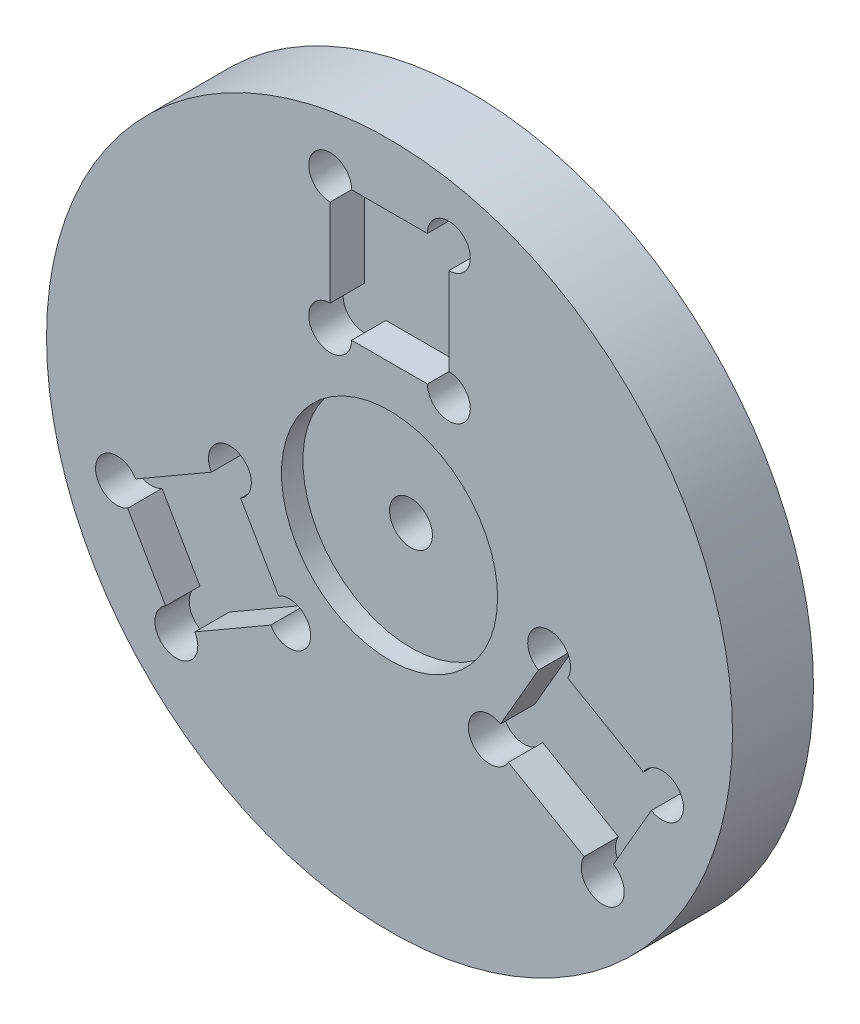
ISO-10303-21;
HEADER;
FILE_DESCRIPTION(('STEP AP214'),'2;1');
FILE_NAME('part.step','',(''),(''),'','','');
FILE_SCHEMA(('AUTOMOTIVE_DESIGN { 1 0 10303 214 1 1 1 1 }'));
ENDSEC;
DATA;
#1=APPLICATION_CONTEXT('core data for automotive mechanical design processes');
#2=APPLICATION_PROTOCOL_DEFINITION('international standard','automotive_design',2000,#1);
#3=PRODUCT_CONTEXT('',#1,'mechanical');
#4=PRODUCT('Part','Part','',(#3));
#5=PRODUCT_RELATED_PRODUCT_CATEGORY('part','',(#4));
#6=PRODUCT_DEFINITION_FORMATION('','',#4);
#7=PRODUCT_DEFINITION_CONTEXT('part definition',#1,'design');
#8=PRODUCT_DEFINITION('design','',#6,#7);
#9=PRODUCT_DEFINITION_SHAPE('','',#8);
#10=(LENGTH_UNIT() NAMED_UNIT(*) SI_UNIT(.MILLI.,.METRE.));
#11=(NAMED_UNIT(*) PLANE_ANGLE_UNIT() SI_UNIT($,.RADIAN.));
#12=(NAMED_UNIT(*) SI_UNIT($,.STERADIAN.) SOLID_ANGLE_UNIT());
#13=UNCERTAINTY_MEASURE_WITH_UNIT(LENGTH_MEASURE(1.E-05),#10,'distance_accuracy_value','');
#14=(GEOMETRIC_REPRESENTATION_CONTEXT(3) GLOBAL_UNCERTAINTY_ASSIGNED_CONTEXT((#13)) GLOBAL_UNIT_ASSIGNED_CONTEXT((#10,
#11,#12)) REPRESENTATION_CONTEXT('',''));
#15=CARTESIAN_POINT('',(0.,0.,0.));
#16=DIRECTION('',(0.,0.,1.));
#17=DIRECTION('',(1.,0.,0.));
#18=AXIS2_PLACEMENT_3D('',#15,#16,#17);
#19=CARTESIAN_POINT('',(0.,0.,11.9888));
#20=DIRECTION('',(0.,0.,-1.));
#21=DIRECTION('',(-1.,0.,0.));
#22=AXIS2_PLACEMENT_3D('',#19,#20,#21);
#23=CYLINDRICAL_SURFACE('',#22,50.8);
#24=CARTESIAN_POINT('',(0.,0.,11.9888));
#25=DIRECTION('',(0.,0.,1.));
#26=DIRECTION('',(1.,0.,0.));
#27=AXIS2_PLACEMENT_3D('',#24,#25,#26);
#28=CIRCLE('',#27,50.8);
#29=CARTESIAN_POINT('',(-50.8,0.,11.9888));
#30=VERTEX_POINT('',#29);
#31=EDGE_CURVE('E11',#30,#30,#28,.T.);
#32=CARTESIAN_POINT('',(0.,0.,0.));
#33=DIRECTION('',(0.,0.,1.));
#34=DIRECTION('',(1.,0.,0.));
#35=AXIS2_PLACEMENT_3D('',#32,#33,#34);
#36=CIRCLE('',#35,50.8);
#37=CARTESIAN_POINT('',(-50.8,0.,0.));
#38=VERTEX_POINT('',#37);
#39=EDGE_CURVE('E35',#38,#38,#36,.T.);
#40=CARTESIAN_POINT('',(-50.8,0.,11.9888));
#41=CARTESIAN_POINT('',(-50.8,0.,11.8639166666667));
#42=CARTESIAN_POINT('',(-50.8,0.,11.7390333333333));
#43=CARTESIAN_POINT('',(-50.8,0.,11.4892666666667));
#44=CARTESIAN_POINT('',(-50.8,0.,11.3643833333333));
#45=CARTESIAN_POINT('',(-50.8,0.,11.1146166666667));
#46=CARTESIAN_POINT('',(-50.8,0.,10.9897333333333));
#47=CARTESIAN_POINT('',(-50.8,0.,10.7399666666667));
#48=CARTESIAN_POINT('',(-50.8,0.,10.6150833333333));
#49=CARTESIAN_POINT('',(-50.8,0.,10.3653166666667));
#50=CARTESIAN_POINT('',(-50.8,0.,10.2404333333333));
#51=CARTESIAN_POINT('',(-50.8,0.,9.99066666666667));
#52=CARTESIAN_POINT('',(-50.8,0.,9.86578333333333));
#53=CARTESIAN_POINT('',(-50.8,0.,9.61601666666667));
#54=CARTESIAN_POINT('',(-50.8,0.,9.49113333333333));
#55=CARTESIAN_POINT('',(-50.8,0.,9.24136666666667));
#56=CARTESIAN_POINT('',(-50.8,0.,9.11648333333333));
#57=CARTESIAN_POINT('',(-50.8,0.,8.86671666666667));
#58=CARTESIAN_POINT('',(-50.8,0.,8.74183333333333));
#59=CARTESIAN_POINT('',(-50.8,0.,8.49206666666666));
#60=CARTESIAN_POINT('',(-50.8,0.,8.36718333333333));
#61=CARTESIAN_POINT('',(-50.8,0.,8.11741666666667));
#62=CARTESIAN_POINT('',(-50.8,0.,7.99253333333333));
#63=CARTESIAN_POINT('',(-50.8,0.,7.74276666666667));
#64=CARTESIAN_POINT('',(-50.8,0.,7.61788333333333));
#65=CARTESIAN_POINT('',(-50.8,0.,7.36811666666667));
#66=CARTESIAN_POINT('',(-50.8,0.,7.24323333333333));
#67=CARTESIAN_POINT('',(-50.8,0.,6.99346666666667));
#68=CARTESIAN_POINT('',(-50.8,0.,6.86858333333333));
#69=CARTESIAN_POINT('',(-50.8,0.,6.61881666666666));
#70=CARTESIAN_POINT('',(-50.8,0.,6.49393333333333));
#71=CARTESIAN_POINT('',(-50.8,0.,6.24416666666666));
#72=CARTESIAN_POINT('',(-50.8,0.,6.11928333333333));
#73=CARTESIAN_POINT('',(-50.8,0.,5.86951666666667));
#74=CARTESIAN_POINT('',(-50.8,0.,5.74463333333333));
#75=CARTESIAN_POINT('',(-50.8,0.,5.49486666666667));
#76=CARTESIAN_POINT('',(-50.8,0.,5.36998333333333));
#77=CARTESIAN_POINT('',(-50.8,0.,5.12021666666667));
#78=CARTESIAN_POINT('',(-50.8,0.,4.99533333333333));
#79=CARTESIAN_POINT('',(-50.8,0.,4.74556666666667));
#80=CARTESIAN_POINT('',(-50.8,0.,4.62068333333333));
#81=CARTESIAN_POINT('',(-50.8,0.,4.37091666666667));
#82=CARTESIAN_POINT('',(-50.8,0.,4.24603333333333));
#83=CARTESIAN_POINT('',(-50.8,0.,3.99626666666667));
#84=CARTESIAN_POINT('',(-50.8,0.,3.87138333333333));
#85=CARTESIAN_POINT('',(-50.8,0.,3.62161666666667));
#86=CARTESIAN_POINT('',(-50.8,0.,3.49673333333333));
#87=CARTESIAN_POINT('',(-50.8,0.,3.24696666666667));
#88=CARTESIAN_POINT('',(-50.8,0.,3.12208333333333));
#89=CARTESIAN_POINT('',(-50.8,0.,2.87231666666667));
#90=CARTESIAN_POINT('',(-50.8,0.,2.74743333333333));
#91=CARTESIAN_POINT('',(-50.8,0.,2.49766666666667));
#92=CARTESIAN_POINT('',(-50.8,0.,2.37278333333333));
#93=CARTESIAN_POINT('',(-50.8,0.,2.12301666666667));
#94=CARTESIAN_POINT('',(-50.8,0.,1.99813333333333));
#95=CARTESIAN_POINT('',(-50.8,0.,1.74836666666667));
#96=CARTESIAN_POINT('',(-50.8,0.,1.62348333333333));
#97=CARTESIAN_POINT('',(-50.8,0.,1.37371666666667));
#98=CARTESIAN_POINT('',(-50.8,0.,1.24883333333333));
#99=CARTESIAN_POINT('',(-50.8,0.,0.999066666666667));
#100=CARTESIAN_POINT('',(-50.8,0.,0.874183333333333));
#101=CARTESIAN_POINT('',(-50.8,0.,0.624416666666667));
#102=CARTESIAN_POINT('',(-50.8,0.,0.499533333333334));
#103=CARTESIAN_POINT('',(-50.8,0.,0.249766666666667));
#104=CARTESIAN_POINT('',(-50.8,0.,0.124883333333333));
#105=CARTESIAN_POINT('',(-50.8,0.,0.));
#106=B_SPLINE_CURVE_WITH_KNOTS('',3,(#40,#41,#42,#43,#44,#45,#46,#47,#48,#49,#50,#51,#52,#53,
#54,#55,#56,#57,#58,#59,#60,#61,#62,#63,#64,#65,#66,#67,#68,#69,#70,#71,#72,#73,#74,#75,#76,#77,
#78,#79,#80,#81,#82,#83,#84,#85,#86,#87,#88,#89,#90,#91,#92,#93,#94,#95,#96,#97,#98,#99,#100,
#101,#102,#103,#104,#105),.UNSPECIFIED.,.F.,.F.,(4,2,2,2,2,2,2,2,2,2,2,2,2,2,2,2,2,2,2,2,2,2,2,
2,2,2,2,2,2,2,2,2,4),(0.,0.374650000000001,0.749300000000001,1.12395,1.4986,1.87325,2.2479,
2.62255,2.9972,3.37185,3.7465,4.12115,4.4958,4.87045,5.2451,5.61975,5.9944,6.36905,6.7437,
7.11835,7.493,7.86765,8.2423,8.61695,8.9916,9.36625,9.7409,10.11555,10.4902,10.86485,11.2395,
11.61415,11.9888),.UNSPECIFIED.);
#107=EDGE_CURVE('BSEAM32',#30,#38,#106,.T.);
#108=ORIENTED_EDGE('',*,*,#31,.F.);
#109=ORIENTED_EDGE('',*,*,#39,.T.);
#110=ORIENTED_EDGE('',*,*,#107,.T.);
#111=ORIENTED_EDGE('',*,*,#107,.F.);
#112=EDGE_LOOP('',(#108,#110,#109,#111));
#113=FACE_BOUND('',#112,.T.);
#114=ADVANCED_FACE('F32',(#113),#23,.T.);
#115=CARTESIAN_POINT('',(0.,0.,11.9888));
#116=DIRECTION('',(0.,0.,1.));
#117=DIRECTION('',(1.,0.,0.));
#118=AXIS2_PLACEMENT_3D('',#115,#116,#117);
#119=PLANE('',#118);
#120=CARTESIAN_POINT('',(0.,0.,11.9888));
#121=DIRECTION('',(0.,0.,1.));
#122=DIRECTION('',(1.,0.,0.));
#123=AXIS2_PLACEMENT_3D('',#120,#121,#122);
#124=CIRCLE('',#123,16.002);
#125=CARTESIAN_POINT('',(16.002,0.,11.9888));
#126=VERTEX_POINT('',#125);
#127=EDGE_CURVE('E633',#126,#126,#124,.T.);
#128=ORIENTED_EDGE('',*,*,#127,.F.);
#129=EDGE_LOOP('',(#128));
#130=FACE_BOUND('',#129,.T.);
#131=CARTESIAN_POINT('',(31.5716039937642,-28.3743778063561,11.9888));
#132=DIRECTION('',(0.,0.,1.));
#133=DIRECTION('',(-0.499999999999992,-0.866025403784443,0.));
#134=AXIS2_PLACEMENT_3D('',#131,#132,#133);
#135=CIRCLE('',#134,3.175);
#136=CARTESIAN_POINT('',(28.8219733367486,-26.7868778063561,11.9888));
#137=VERTEX_POINT('',#136);
#138=CARTESIAN_POINT('',(33.1591039937642,-25.6247471493404,11.9888));
#139=VERTEX_POINT('',#138);
#140=EDGE_CURVE('E197',#137,#139,#135,.T.);
#141=ORIENTED_EDGE('',*,*,#140,.F.);
#142=DIRECTION('',(0.866025403784443,-0.499999999999992,0.));
#143=VECTOR('',#142,1.);
#144=CARTESIAN_POINT('',(31.5716039937642,-28.3743778063561,11.9888));
#145=LINE('',#144,#143);
#146=CARTESIAN_POINT('',(17.6034802561249,-20.3098778063562,11.9888));
#147=VERTEX_POINT('',#146);
#148=EDGE_CURVE('E206',#147,#137,#145,.T.);
#149=ORIENTED_EDGE('',*,*,#148,.F.);
#150=CARTESIAN_POINT('',(14.8538495991093,-18.7223778063562,11.9888));
#151=DIRECTION('',(0.,0.,1.));
#152=DIRECTION('',(-0.499999999999992,-0.866025403784443,0.));
#153=AXIS2_PLACEMENT_3D('',#150,#151,#152);
#154=CIRCLE('',#153,3.175);
#155=CARTESIAN_POINT('',(16.4413495991093,-15.9727471493406,11.9888));
#156=VERTEX_POINT('',#155);
#157=EDGE_CURVE('E207',#156,#147,#154,.T.);
#158=ORIENTED_EDGE('',*,*,#157,.F.);
#159=DIRECTION('',(-0.499999999999992,-0.866025403784443,0.));
#160=VECTOR('',#159,1.);
#161=CARTESIAN_POINT('',(23.6409795991092,-3.50262219364343,11.9888));
#162=LINE('',#161,#160);
#163=CARTESIAN_POINT('',(22.0534795991092,-6.25225285065904,11.9888));
#164=VERTEX_POINT('',#163);
#165=EDGE_CURVE('E214',#164,#156,#162,.T.);
#166=ORIENTED_EDGE('',*,*,#165,.F.);
#167=CARTESIAN_POINT('',(23.6409795991092,-3.50262219364343,11.9888));
#168=DIRECTION('',(0.,0.,1.));
#169=DIRECTION('',(-0.499999999999992,-0.866025403784443,0.));
#170=AXIS2_PLACEMENT_3D('',#167,#168,#169);
#171=CIRCLE('',#170,3.175);
#172=CARTESIAN_POINT('',(26.3906102561248,-5.09012219364341,11.9888));
#173=VERTEX_POINT('',#172);
#174=EDGE_CURVE('E650',#173,#164,#171,.T.);
#175=ORIENTED_EDGE('',*,*,#174,.F.);
#176=DIRECTION('',(-0.866025403784443,0.499999999999992,0.));
#177=VECTOR('',#176,1.);
#178=CARTESIAN_POINT('',(40.3587339937641,-13.1546221936433,11.9888));
#179=LINE('',#178,#177);
#180=CARTESIAN_POINT('',(37.6091033367485,-11.5671221936433,11.9888));
#181=VERTEX_POINT('',#180);
#182=EDGE_CURVE('E219',#181,#173,#179,.T.);
#183=ORIENTED_EDGE('',*,*,#182,.F.);
#184=CARTESIAN_POINT('',(40.3587339937641,-13.1546221936433,11.9888));
#185=DIRECTION('',(0.,0.,1.));
#186=DIRECTION('',(-0.499999999999992,-0.866025403784443,0.));
#187=AXIS2_PLACEMENT_3D('',#184,#185,#186);
#188=CIRCLE('',#187,3.175);
#189=CARTESIAN_POINT('',(38.7712339937641,-15.9042528506589,11.9888));
#190=VERTEX_POINT('',#189);
#191=EDGE_CURVE('E660',#190,#181,#188,.T.);
#192=ORIENTED_EDGE('',*,*,#191,.F.);
#193=DIRECTION('',(0.499999999999992,0.866025403784443,0.));
#194=VECTOR('',#193,1.);
#195=CARTESIAN_POINT('',(40.3587339937641,-13.1546221936433,11.9888));
#196=LINE('',#195,#194);
#197=EDGE_CURVE('E231',#139,#190,#196,.T.);
#198=ORIENTED_EDGE('',*,*,#197,.F.);
#199=EDGE_LOOP('',(#141,#149,#158,#166,#175,#183,#192,#198));
#200=FACE_BOUND('',#199,.T.);
#201=CARTESIAN_POINT('',(-40.3587339937639,-13.1546221936438,11.9888));
#202=DIRECTION('',(0.,0.,1.));
#203=DIRECTION('',(-0.500000000000004,0.866025403784436,0.));
#204=AXIS2_PLACEMENT_3D('',#201,#202,#203);
#205=CIRCLE('',#204,3.175);
#206=CARTESIAN_POINT('',(-37.6091033367483,-11.5671221936438,11.9888));
#207=VERTEX_POINT('',#206);
#208=CARTESIAN_POINT('',(-38.7712339937639,-15.9042528506594,11.9888));
#209=VERTEX_POINT('',#208);
#210=EDGE_CURVE('E671',#207,#209,#205,.T.);
#211=ORIENTED_EDGE('',*,*,#210,.F.);
#212=DIRECTION('',(-0.866025403784436,-0.500000000000004,0.));
#213=VECTOR('',#212,1.);
#214=CARTESIAN_POINT('',(-40.3587339937639,-13.1546221936438,11.9888));
#215=LINE('',#214,#213);
#216=CARTESIAN_POINT('',(-26.3906102561247,-5.09012219364377,11.9888));
#217=VERTEX_POINT('',#216);
#218=EDGE_CURVE('E229',#217,#207,#215,.T.);
#219=ORIENTED_EDGE('',*,*,#218,.F.);
#220=CARTESIAN_POINT('',(-23.6409795991091,-3.50262219364376,11.9888));
#221=DIRECTION('',(0.,0.,1.));
#222=DIRECTION('',(-0.500000000000004,0.866025403784436,0.));
#223=AXIS2_PLACEMENT_3D('',#220,#221,#222);
#224=CIRCLE('',#223,3.175);
#225=CARTESIAN_POINT('',(-22.0534795991091,-6.25225285065934,11.9888));
#226=VERTEX_POINT('',#225);
#227=EDGE_CURVE('E680',#226,#217,#224,.T.);
#228=ORIENTED_EDGE('',*,*,#227,.F.);
#229=DIRECTION('',(-0.500000000000004,0.866025403784436,0.));
#230=VECTOR('',#229,1.);
#231=CARTESIAN_POINT('',(-14.8538495991091,-18.7223778063564,11.9888));
#232=LINE('',#231,#230);
#233=CARTESIAN_POINT('',(-16.4413495991091,-15.9727471493408,11.9888));
#234=VERTEX_POINT('',#233);
#235=EDGE_CURVE('E238',#234,#226,#232,.T.);
#236=ORIENTED_EDGE('',*,*,#235,.F.);
#237=CARTESIAN_POINT('',(-14.8538495991091,-18.7223778063564,11.9888));
#238=DIRECTION('',(0.,0.,1.));
#239=DIRECTION('',(-0.500000000000004,0.866025403784436,0.));
#240=AXIS2_PLACEMENT_3D('',#237,#238,#239);
#241=CIRCLE('',#240,3.175);
#242=CARTESIAN_POINT('',(-17.6034802561247,-20.3098778063564,11.9888));
#243=VERTEX_POINT('',#242);
#244=EDGE_CURVE('E690',#243,#234,#241,.T.);
#245=ORIENTED_EDGE('',*,*,#244,.F.);
#246=DIRECTION('',(0.866025403784436,0.500000000000004,0.));
#247=VECTOR('',#246,1.);
#248=CARTESIAN_POINT('',(-31.5716039937638,-28.3743778063565,11.9888));
#249=LINE('',#248,#247);
#250=CARTESIAN_POINT('',(-28.8219733367482,-26.7868778063565,11.9888));
#251=VERTEX_POINT('',#250);
#252=EDGE_CURVE('E251',#251,#243,#249,.T.);
#253=ORIENTED_EDGE('',*,*,#252,.F.);
#254=CARTESIAN_POINT('',(-31.5716039937638,-28.3743778063565,11.9888));
#255=DIRECTION('',(0.,0.,1.));
#256=DIRECTION('',(-0.500000000000004,0.866025403784436,0.));
#257=AXIS2_PLACEMENT_3D('',#254,#255,#256);
#258=CIRCLE('',#257,3.175);
#259=CARTESIAN_POINT('',(-33.1591039937638,-25.6247471493409,11.9888));
#260=VERTEX_POINT('',#259);
#261=EDGE_CURVE('E700',#260,#251,#258,.T.);
#262=ORIENTED_EDGE('',*,*,#261,.F.);
#263=DIRECTION('',(0.500000000000004,-0.866025403784436,0.));
#264=VECTOR('',#263,1.);
#265=CARTESIAN_POINT('',(-31.5716039937638,-28.3743778063565,11.9888));
#266=LINE('',#265,#264);
#267=EDGE_CURVE('E249',#209,#260,#266,.T.);
#268=ORIENTED_EDGE('',*,*,#267,.F.);
#269=EDGE_LOOP('',(#211,#219,#228,#236,#245,#253,#262,#268));
#270=FACE_BOUND('',#269,.T.);
#271=CARTESIAN_POINT('',(8.78713,41.529,11.9888));
#272=DIRECTION('',(0.,0.,1.));
#273=DIRECTION('',(1.,0.,0.));
#274=AXIS2_PLACEMENT_3D('',#271,#272,#273);
#275=CIRCLE('',#274,3.175);
#276=CARTESIAN_POINT('',(8.78713,38.354,11.9888));
#277=VERTEX_POINT('',#276);
#278=CARTESIAN_POINT('',(5.61213,41.529,11.9888));
#279=VERTEX_POINT('',#278);
#280=EDGE_CURVE('E246',#277,#279,#275,.T.);
#281=ORIENTED_EDGE('',*,*,#280,.F.);
#282=DIRECTION('',(0.,1.,0.));
#283=VECTOR('',#282,1.);
#284=CARTESIAN_POINT('',(8.78713,41.529,11.9888));
#285=LINE('',#284,#283);
#286=CARTESIAN_POINT('',(8.78713,25.4,11.9888));
#287=VERTEX_POINT('',#286);
#288=EDGE_CURVE('E296',#287,#277,#285,.T.);
#289=ORIENTED_EDGE('',*,*,#288,.F.);
#290=CARTESIAN_POINT('',(8.78713,22.225,11.9888));
#291=DIRECTION('',(0.,0.,1.));
#292=DIRECTION('',(1.,0.,0.));
#293=AXIS2_PLACEMENT_3D('',#290,#291,#292);
#294=CIRCLE('',#293,3.175);
#295=CARTESIAN_POINT('',(5.61213,22.225,11.9888));
#296=VERTEX_POINT('',#295);
#297=EDGE_CURVE('E265',#296,#287,#294,.T.);
#298=ORIENTED_EDGE('',*,*,#297,.F.);
#299=DIRECTION('',(1.,0.,0.));
#300=VECTOR('',#299,1.);
#301=CARTESIAN_POINT('',(-8.78713,22.225,11.9888));
#302=LINE('',#301,#300);
#303=CARTESIAN_POINT('',(-5.61213,22.225,11.9888));
#304=VERTEX_POINT('',#303);
#305=EDGE_CURVE('E301',#304,#296,#302,.T.);
#306=ORIENTED_EDGE('',*,*,#305,.F.);
#307=CARTESIAN_POINT('',(-8.78713,22.225,11.9888));
#308=DIRECTION('',(0.,0.,1.));
#309=DIRECTION('',(1.,0.,0.));
#310=AXIS2_PLACEMENT_3D('',#307,#308,#309);
#311=CIRCLE('',#310,3.175);
#312=CARTESIAN_POINT('',(-8.78713,25.4,11.9888));
#313=VERTEX_POINT('',#312);
#314=EDGE_CURVE('E275',#313,#304,#311,.T.);
#315=ORIENTED_EDGE('',*,*,#314,.F.);
#316=DIRECTION('',(0.,-1.,0.));
#317=VECTOR('',#316,1.);
#318=CARTESIAN_POINT('',(-8.78713,41.529,11.9888));
#319=LINE('',#318,#317);
#320=CARTESIAN_POINT('',(-8.78713,38.354,11.9888));
#321=VERTEX_POINT('',#320);
#322=EDGE_CURVE('E313',#321,#313,#319,.T.);
#323=ORIENTED_EDGE('',*,*,#322,.F.);
#324=CARTESIAN_POINT('',(-8.78713,41.529,11.9888));
#325=DIRECTION('',(0.,0.,1.));
#326=DIRECTION('',(1.,0.,0.));
#327=AXIS2_PLACEMENT_3D('',#324,#325,#326);
#328=CIRCLE('',#327,3.175);
#329=CARTESIAN_POINT('',(-5.61213,41.529,11.9888));
#330=VERTEX_POINT('',#329);
#331=EDGE_CURVE('E285',#330,#321,#328,.T.);
#332=ORIENTED_EDGE('',*,*,#331,.F.);
#333=DIRECTION('',(-1.,0.,0.));
#334=VECTOR('',#333,1.);
#335=CARTESIAN_POINT('',(-8.78713,41.529,11.9888));
#336=LINE('',#335,#334);
#337=EDGE_CURVE('E311',#279,#330,#336,.T.);
#338=ORIENTED_EDGE('',*,*,#337,.F.);
#339=EDGE_LOOP('',(#281,#289,#298,#306,#315,#323,#332,#338));
#340=FACE_BOUND('',#339,.T.);
#341=ORIENTED_EDGE('',*,*,#31,.T.);
#342=EDGE_LOOP('',(#341));
#343=FACE_BOUND('',#342,.T.);
#344=ADVANCED_FACE('F325',(#130,#200,#270,#340,#343),#119,.T.);
#345=CARTESIAN_POINT('',(0.,0.,0.));
#346=DIRECTION('',(0.,0.,1.));
#347=DIRECTION('',(1.,0.,0.));
#348=AXIS2_PLACEMENT_3D('',#345,#346,#347);
#349=PLANE('',#348);
#350=CARTESIAN_POINT('',(0.,0.,0.));
#351=DIRECTION('',(0.,0.,1.));
#352=DIRECTION('',(1.,0.,0.));
#353=AXIS2_PLACEMENT_3D('',#350,#351,#352);
#354=CIRCLE('',#353,3.175);
#355=CARTESIAN_POINT('',(3.175,0.,0.));
#356=VERTEX_POINT('',#355);
#357=EDGE_CURVE('E628',#356,#356,#354,.T.);
#358=ORIENTED_EDGE('',*,*,#357,.T.);
#359=EDGE_LOOP('',(#358));
#360=FACE_BOUND('',#359,.T.);
#361=ORIENTED_EDGE('',*,*,#39,.F.);
#362=EDGE_LOOP('',(#361));
#363=FACE_BOUND('',#362,.T.);
#364=ADVANCED_FACE('F371',(#360,#363),#349,.F.);
#365=CARTESIAN_POINT('',(8.78713,41.529,6.9088));
#366=DIRECTION('',(1.,0.,0.));
#367=DIRECTION('',(0.,1.,0.));
#368=AXIS2_PLACEMENT_3D('',#365,#366,#367);
#369=PLANE('',#368);
#370=ORIENTED_EDGE('',*,*,#288,.T.);
#371=DIRECTION('',(0.,0.,1.));
#372=VECTOR('',#371,1.);
#373=CARTESIAN_POINT('',(8.78713,38.354,-2.07145612106916));
#374=LINE('',#373,#372);
#375=CARTESIAN_POINT('',(8.78713,38.354,6.9088));
#376=VERTEX_POINT('',#375);
#377=EDGE_CURVE('E262',#277,#376,#374,.F.);
#378=ORIENTED_EDGE('',*,*,#377,.T.);
#379=DIRECTION('',(0.,1.,0.));
#380=VECTOR('',#379,1.);
#381=CARTESIAN_POINT('',(8.78713,41.529,6.9088));
#382=LINE('',#381,#380);
#383=CARTESIAN_POINT('',(8.78713,25.4,6.9088));
#384=VERTEX_POINT('',#383);
#385=EDGE_CURVE('E297',#384,#376,#382,.T.);
#386=ORIENTED_EDGE('',*,*,#385,.F.);
#387=DIRECTION('',(0.,0.,1.));
#388=VECTOR('',#387,1.);
#389=CARTESIAN_POINT('',(8.78713,25.4,-2.07145612106916));
#390=LINE('',#389,#388);
#391=EDGE_CURVE('E272',#384,#287,#390,.T.);
#392=ORIENTED_EDGE('',*,*,#391,.T.);
#393=EDGE_LOOP('',(#370,#378,#386,#392));
#394=FACE_BOUND('',#393,.T.);
#395=ADVANCED_FACE('F334',(#394),#369,.F.);
#396=CARTESIAN_POINT('',(-8.78713,22.225,6.9088));
#397=DIRECTION('',(0.,-1.,0.));
#398=DIRECTION('',(0.,0.,-1.));
#399=AXIS2_PLACEMENT_3D('',#396,#397,#398);
#400=PLANE('',#399);
#401=ORIENTED_EDGE('',*,*,#305,.T.);
#402=DIRECTION('',(0.,0.,1.));
#403=VECTOR('',#402,1.);
#404=CARTESIAN_POINT('',(5.61213,22.225,-2.07145612106916));
#405=LINE('',#404,#403);
#406=CARTESIAN_POINT('',(5.61213,22.225,6.9088));
#407=VERTEX_POINT('',#406);
#408=EDGE_CURVE('E269',#296,#407,#405,.F.);
#409=ORIENTED_EDGE('',*,*,#408,.T.);
#410=DIRECTION('',(1.,0.,0.));
#411=VECTOR('',#410,1.);
#412=CARTESIAN_POINT('',(-8.78713,22.225,6.9088));
#413=LINE('',#412,#411);
#414=CARTESIAN_POINT('',(-5.61213,22.225,6.9088));
#415=VERTEX_POINT('',#414);
#416=EDGE_CURVE('E306',#415,#407,#413,.T.);
#417=ORIENTED_EDGE('',*,*,#416,.F.);
#418=DIRECTION('',(0.,0.,1.));
#419=VECTOR('',#418,1.);
#420=CARTESIAN_POINT('',(-5.61213,22.225,-2.07145612106916));
#421=LINE('',#420,#419);
#422=EDGE_CURVE('E282',#415,#304,#421,.T.);
#423=ORIENTED_EDGE('',*,*,#422,.T.);
#424=EDGE_LOOP('',(#401,#409,#417,#423));
#425=FACE_BOUND('',#424,.T.);
#426=ADVANCED_FACE('F319',(#425),#400,.F.);
#427=CARTESIAN_POINT('',(-8.78713,41.529,6.9088));
#428=DIRECTION('',(-1.,0.,0.));
#429=DIRECTION('',(0.,-1.,0.));
#430=AXIS2_PLACEMENT_3D('',#427,#428,#429);
#431=PLANE('',#430);
#432=ORIENTED_EDGE('',*,*,#322,.T.);
#433=DIRECTION('',(0.,0.,1.));
#434=VECTOR('',#433,1.);
#435=CARTESIAN_POINT('',(-8.78713,25.4,-2.07145612106916));
#436=LINE('',#435,#434);
#437=CARTESIAN_POINT('',(-8.78713,25.4,6.9088));
#438=VERTEX_POINT('',#437);
#439=EDGE_CURVE('E279',#313,#438,#436,.F.);
#440=ORIENTED_EDGE('',*,*,#439,.T.);
#441=DIRECTION('',(0.,-1.,0.));
#442=VECTOR('',#441,1.);
#443=CARTESIAN_POINT('',(-8.78713,41.529,6.9088));
#444=LINE('',#443,#442);
#445=CARTESIAN_POINT('',(-8.78713,38.354,6.9088));
#446=VERTEX_POINT('',#445);
#447=EDGE_CURVE('E303',#446,#438,#444,.T.);
#448=ORIENTED_EDGE('',*,*,#447,.F.);
#449=DIRECTION('',(0.,0.,1.));
#450=VECTOR('',#449,1.);
#451=CARTESIAN_POINT('',(-8.78713,38.354,-2.07145612106916));
#452=LINE('',#451,#450);
#453=EDGE_CURVE('E293',#446,#321,#452,.T.);
#454=ORIENTED_EDGE('',*,*,#453,.T.);
#455=EDGE_LOOP('',(#432,#440,#448,#454));
#456=FACE_BOUND('',#455,.T.);
#457=ADVANCED_FACE('F344',(#456),#431,.F.);
#458=CARTESIAN_POINT('',(-8.78713,41.529,6.9088));
#459=DIRECTION('',(0.,1.,0.));
#460=DIRECTION('',(0.,0.,1.));
#461=AXIS2_PLACEMENT_3D('',#458,#459,#460);
#462=PLANE('',#461);
#463=DIRECTION('',(-1.,0.,0.));
#464=VECTOR('',#463,1.);
#465=CARTESIAN_POINT('',(-8.78713,41.529,6.9088));
#466=LINE('',#465,#464);
#467=CARTESIAN_POINT('',(5.61213,41.529,6.9088));
#468=VERTEX_POINT('',#467);
#469=CARTESIAN_POINT('',(-5.61213,41.529,6.9088));
#470=VERTEX_POINT('',#469);
#471=EDGE_CURVE('E300',#468,#470,#466,.T.);
#472=ORIENTED_EDGE('',*,*,#471,.F.);
#473=DIRECTION('',(0.,0.,1.));
#474=VECTOR('',#473,1.);
#475=CARTESIAN_POINT('',(5.61213,41.529,-2.07145612106916));
#476=LINE('',#475,#474);
#477=EDGE_CURVE('E259',#468,#279,#476,.T.);
#478=ORIENTED_EDGE('',*,*,#477,.T.);
#479=ORIENTED_EDGE('',*,*,#337,.T.);
#480=DIRECTION('',(0.,0.,1.));
#481=VECTOR('',#480,1.);
#482=CARTESIAN_POINT('',(-5.61213,41.529,-2.07145612106916));
#483=LINE('',#482,#481);
#484=EDGE_CURVE('E290',#330,#470,#483,.F.);
#485=ORIENTED_EDGE('',*,*,#484,.T.);
#486=EDGE_LOOP('',(#472,#478,#479,#485));
#487=FACE_BOUND('',#486,.T.);
#488=ADVANCED_FACE('F352',(#487),#462,.F.);
#489=CARTESIAN_POINT('',(0.,0.,6.9088));
#490=DIRECTION('',(0.,0.,1.));
#491=DIRECTION('',(1.,0.,0.));
#492=AXIS2_PLACEMENT_3D('',#489,#490,#491);
#493=PLANE('',#492);
#494=ORIENTED_EDGE('',*,*,#385,.T.);
#495=CARTESIAN_POINT('',(8.78713,41.529,6.9088));
#496=DIRECTION('',(0.,0.,1.));
#497=DIRECTION('',(1.,0.,0.));
#498=AXIS2_PLACEMENT_3D('',#495,#496,#497);
#499=CIRCLE('',#498,3.175);
#500=EDGE_CURVE('E257',#468,#376,#499,.F.);
#501=ORIENTED_EDGE('',*,*,#500,.F.);
#502=ORIENTED_EDGE('',*,*,#471,.T.);
#503=CARTESIAN_POINT('',(-8.78713,41.529,6.9088));
#504=DIRECTION('',(0.,0.,1.));
#505=DIRECTION('',(1.,0.,0.));
#506=AXIS2_PLACEMENT_3D('',#503,#504,#505);
#507=CIRCLE('',#506,3.175);
#508=EDGE_CURVE('E287',#446,#470,#507,.F.);
#509=ORIENTED_EDGE('',*,*,#508,.F.);
#510=ORIENTED_EDGE('',*,*,#447,.T.);
#511=CARTESIAN_POINT('',(-8.78713,22.225,6.9088));
#512=DIRECTION('',(0.,0.,1.));
#513=DIRECTION('',(1.,0.,0.));
#514=AXIS2_PLACEMENT_3D('',#511,#512,#513);
#515=CIRCLE('',#514,3.175);
#516=EDGE_CURVE('E277',#415,#438,#515,.F.);
#517=ORIENTED_EDGE('',*,*,#516,.F.);
#518=ORIENTED_EDGE('',*,*,#416,.T.);
#519=CARTESIAN_POINT('',(8.78713,22.225,6.9088));
#520=DIRECTION('',(0.,0.,1.));
#521=DIRECTION('',(1.,0.,0.));
#522=AXIS2_PLACEMENT_3D('',#519,#520,#521);
#523=CIRCLE('',#522,3.175);
#524=EDGE_CURVE('E267',#384,#407,#523,.F.);
#525=ORIENTED_EDGE('',*,*,#524,.F.);
#526=EDGE_LOOP('',(#494,#501,#502,#509,#510,#517,#518,#525));
#527=FACE_BOUND('',#526,.T.);
#528=ADVANCED_FACE('F336',(#527),#493,.T.);
#529=CARTESIAN_POINT('',(-8.78713,41.529,-2.07145612106916));
#530=DIRECTION('',(0.,0.,1.));
#531=DIRECTION('',(1.,0.,0.));
#532=AXIS2_PLACEMENT_3D('',#529,#530,#531);
#533=CYLINDRICAL_SURFACE('',#532,3.175);
#534=ORIENTED_EDGE('',*,*,#508,.T.);
#535=ORIENTED_EDGE('',*,*,#484,.F.);
#536=ORIENTED_EDGE('',*,*,#331,.T.);
#537=ORIENTED_EDGE('',*,*,#453,.F.);
#538=EDGE_LOOP('',(#534,#535,#536,#537));
#539=FACE_BOUND('',#538,.T.);
#540=ADVANCED_FACE('F349',(#539),#533,.F.);
#541=CARTESIAN_POINT('',(-8.78713,22.225,-2.07145612106916));
#542=DIRECTION('',(0.,0.,1.));
#543=DIRECTION('',(1.,0.,0.));
#544=AXIS2_PLACEMENT_3D('',#541,#542,#543);
#545=CYLINDRICAL_SURFACE('',#544,3.175);
#546=ORIENTED_EDGE('',*,*,#516,.T.);
#547=ORIENTED_EDGE('',*,*,#439,.F.);
#548=ORIENTED_EDGE('',*,*,#314,.T.);
#549=ORIENTED_EDGE('',*,*,#422,.F.);
#550=EDGE_LOOP('',(#546,#547,#548,#549));
#551=FACE_BOUND('',#550,.T.);
#552=ADVANCED_FACE('F342',(#551),#545,.F.);
#553=CARTESIAN_POINT('',(8.78713,22.225,-2.07145612106916));
#554=DIRECTION('',(0.,0.,1.));
#555=DIRECTION('',(1.,0.,0.));
#556=AXIS2_PLACEMENT_3D('',#553,#554,#555);
#557=CYLINDRICAL_SURFACE('',#556,3.175);
#558=ORIENTED_EDGE('',*,*,#524,.T.);
#559=ORIENTED_EDGE('',*,*,#408,.F.);
#560=ORIENTED_EDGE('',*,*,#297,.T.);
#561=ORIENTED_EDGE('',*,*,#391,.F.);
#562=EDGE_LOOP('',(#558,#559,#560,#561));
#563=FACE_BOUND('',#562,.T.);
#564=ADVANCED_FACE('F330',(#563),#557,.F.);
#565=CARTESIAN_POINT('',(8.78713,41.529,-2.07145612106916));
#566=DIRECTION('',(0.,0.,1.));
#567=DIRECTION('',(1.,0.,0.));
#568=AXIS2_PLACEMENT_3D('',#565,#566,#567);
#569=CYLINDRICAL_SURFACE('',#568,3.175);
#570=ORIENTED_EDGE('',*,*,#280,.T.);
#571=ORIENTED_EDGE('',*,*,#477,.F.);
#572=ORIENTED_EDGE('',*,*,#500,.T.);
#573=ORIENTED_EDGE('',*,*,#377,.F.);
#574=EDGE_LOOP('',(#570,#571,#572,#573));
#575=FACE_BOUND('',#574,.T.);
#576=ADVANCED_FACE('F354',(#575),#569,.F.);
#577=CARTESIAN_POINT('',(-40.3587339937639,-13.1546221936438,6.9088));
#578=DIRECTION('',(-0.500000000000004,0.866025403784436,0.));
#579=DIRECTION('',(-0.866025403784436,-0.500000000000004,0.));
#580=AXIS2_PLACEMENT_3D('',#577,#578,#579);
#581=PLANE('',#580);
#582=ORIENTED_EDGE('',*,*,#218,.T.);
#583=DIRECTION('',(0.,0.,1.));
#584=VECTOR('',#583,1.);
#585=CARTESIAN_POINT('',(-37.6091033367483,-11.5671221936438,-2.07145612106916));
#586=LINE('',#585,#584);
#587=CARTESIAN_POINT('',(-37.6091033367483,-11.5671221936438,6.9088));
#588=VERTEX_POINT('',#587);
#589=EDGE_CURVE('E677',#207,#588,#586,.F.);
#590=ORIENTED_EDGE('',*,*,#589,.T.);
#591=DIRECTION('',(-0.866025403784436,-0.500000000000004,0.));
#592=VECTOR('',#591,1.);
#593=CARTESIAN_POINT('',(-40.3587339937639,-13.1546221936438,6.9088));
#594=LINE('',#593,#592);
#595=CARTESIAN_POINT('',(-26.3906102561247,-5.09012219364377,6.9088));
#596=VERTEX_POINT('',#595);
#597=EDGE_CURVE('E235',#596,#588,#594,.T.);
#598=ORIENTED_EDGE('',*,*,#597,.F.);
#599=DIRECTION('',(0.,0.,1.));
#600=VECTOR('',#599,1.);
#601=CARTESIAN_POINT('',(-26.3906102561247,-5.09012219364377,-2.07145612106916));
#602=LINE('',#601,#600);
#603=EDGE_CURVE('E687',#596,#217,#602,.T.);
#604=ORIENTED_EDGE('',*,*,#603,.T.);
#605=EDGE_LOOP('',(#582,#590,#598,#604));
#606=FACE_BOUND('',#605,.T.);
#607=ADVANCED_FACE('F356',(#606),#581,.F.);
#608=CARTESIAN_POINT('',(-14.8538495991091,-18.7223778063564,6.9088));
#609=DIRECTION('',(0.866025403784436,0.500000000000004,0.));
#610=DIRECTION('',(-0.500000000000004,0.866025403784436,0.));
#611=AXIS2_PLACEMENT_3D('',#608,#609,#610);
#612=PLANE('',#611);
#613=ORIENTED_EDGE('',*,*,#235,.T.);
#614=DIRECTION('',(0.,0.,1.));
#615=VECTOR('',#614,1.);
#616=CARTESIAN_POINT('',(-22.0534795991091,-6.25225285065934,-2.07145612106916));
#617=LINE('',#616,#615);
#618=CARTESIAN_POINT('',(-22.0534795991091,-6.25225285065934,6.9088));
#619=VERTEX_POINT('',#618);
#620=EDGE_CURVE('E684',#226,#619,#617,.F.);
#621=ORIENTED_EDGE('',*,*,#620,.T.);
#622=DIRECTION('',(-0.500000000000004,0.866025403784436,0.));
#623=VECTOR('',#622,1.);
#624=CARTESIAN_POINT('',(-14.8538495991091,-18.7223778063564,6.9088));
#625=LINE('',#624,#623);
#626=CARTESIAN_POINT('',(-16.4413495991091,-15.9727471493408,6.9088));
#627=VERTEX_POINT('',#626);
#628=EDGE_CURVE('E243',#627,#619,#625,.T.);
#629=ORIENTED_EDGE('',*,*,#628,.F.);
#630=DIRECTION('',(0.,0.,1.));
#631=VECTOR('',#630,1.);
#632=CARTESIAN_POINT('',(-16.4413495991091,-15.9727471493408,-2.07145612106916));
#633=LINE('',#632,#631);
#634=EDGE_CURVE('E697',#627,#234,#633,.T.);
#635=ORIENTED_EDGE('',*,*,#634,.T.);
#636=EDGE_LOOP('',(#613,#621,#629,#635));
#637=FACE_BOUND('',#636,.T.);
#638=ADVANCED_FACE('F362',(#637),#612,.F.);
#639=CARTESIAN_POINT('',(-31.5716039937638,-28.3743778063565,6.9088));
#640=DIRECTION('',(0.500000000000004,-0.866025403784436,0.));
#641=DIRECTION('',(0.866025403784436,0.500000000000004,0.));
#642=AXIS2_PLACEMENT_3D('',#639,#640,#641);
#643=PLANE('',#642);
#644=ORIENTED_EDGE('',*,*,#252,.T.);
#645=DIRECTION('',(0.,0.,1.));
#646=VECTOR('',#645,1.);
#647=CARTESIAN_POINT('',(-17.6034802561247,-20.3098778063564,-2.07145612106916));
#648=LINE('',#647,#646);
#649=CARTESIAN_POINT('',(-17.6034802561247,-20.3098778063564,6.9088));
#650=VERTEX_POINT('',#649);
#651=EDGE_CURVE('E694',#243,#650,#648,.F.);
#652=ORIENTED_EDGE('',*,*,#651,.T.);
#653=DIRECTION('',(0.866025403784436,0.500000000000004,0.));
#654=VECTOR('',#653,1.);
#655=CARTESIAN_POINT('',(-31.5716039937638,-28.3743778063565,6.9088));
#656=LINE('',#655,#654);
#657=CARTESIAN_POINT('',(-28.8219733367482,-26.7868778063565,6.9088));
#658=VERTEX_POINT('',#657);
#659=EDGE_CURVE('E240',#658,#650,#656,.T.);
#660=ORIENTED_EDGE('',*,*,#659,.F.);
#661=DIRECTION('',(0.,0.,1.));
#662=VECTOR('',#661,1.);
#663=CARTESIAN_POINT('',(-28.8219733367482,-26.7868778063565,-2.07145612106916));
#664=LINE('',#663,#662);
#665=EDGE_CURVE('E222',#658,#251,#664,.T.);
#666=ORIENTED_EDGE('',*,*,#665,.T.);
#667=EDGE_LOOP('',(#644,#652,#660,#666));
#668=FACE_BOUND('',#667,.T.);
#669=ADVANCED_FACE('F425',(#668),#643,.F.);
#670=CARTESIAN_POINT('',(-31.5716039937638,-28.3743778063565,6.9088));
#671=DIRECTION('',(-0.866025403784436,-0.500000000000004,0.));
#672=DIRECTION('',(0.500000000000004,-0.866025403784436,0.));
#673=AXIS2_PLACEMENT_3D('',#670,#671,#672);
#674=PLANE('',#673);
#675=DIRECTION('',(0.500000000000004,-0.866025403784436,0.));
#676=VECTOR('',#675,1.);
#677=CARTESIAN_POINT('',(-31.5716039937638,-28.3743778063565,6.9088));
#678=LINE('',#677,#676);
#679=CARTESIAN_POINT('',(-38.7712339937639,-15.9042528506594,6.9088));
#680=VERTEX_POINT('',#679);
#681=CARTESIAN_POINT('',(-33.1591039937638,-25.6247471493409,6.9088));
#682=VERTEX_POINT('',#681);
#683=EDGE_CURVE('E237',#680,#682,#678,.T.);
#684=ORIENTED_EDGE('',*,*,#683,.F.);
#685=DIRECTION('',(0.,0.,1.));
#686=VECTOR('',#685,1.);
#687=CARTESIAN_POINT('',(-38.7712339937639,-15.9042528506594,-2.07145612106916));
#688=LINE('',#687,#686);
#689=EDGE_CURVE('E674',#680,#209,#688,.T.);
#690=ORIENTED_EDGE('',*,*,#689,.T.);
#691=ORIENTED_EDGE('',*,*,#267,.T.);
#692=DIRECTION('',(0.,0.,1.));
#693=VECTOR('',#692,1.);
#694=CARTESIAN_POINT('',(-33.1591039937638,-25.6247471493409,-2.07145612106916));
#695=LINE('',#694,#693);
#696=EDGE_CURVE('E704',#260,#682,#695,.F.);
#697=ORIENTED_EDGE('',*,*,#696,.T.);
#698=EDGE_LOOP('',(#684,#690,#691,#697));
#699=FACE_BOUND('',#698,.T.);
#700=ADVANCED_FACE('F435',(#699),#674,.F.);
#701=CARTESIAN_POINT('',(0.,0.,6.9088));
#702=DIRECTION('',(0.,0.,1.));
#703=DIRECTION('',(-0.500000000000004,0.866025403784436,0.));
#704=AXIS2_PLACEMENT_3D('',#701,#702,#703);
#705=PLANE('',#704);
#706=ORIENTED_EDGE('',*,*,#597,.T.);
#707=CARTESIAN_POINT('',(-40.3587339937639,-13.1546221936438,6.9088));
#708=DIRECTION('',(0.,0.,1.));
#709=DIRECTION('',(1.,0.,0.));
#710=AXIS2_PLACEMENT_3D('',#707,#708,#709);
#711=CIRCLE('',#710,3.175);
#712=EDGE_CURVE('E54',#680,#588,#711,.F.);
#713=ORIENTED_EDGE('',*,*,#712,.F.);
#714=ORIENTED_EDGE('',*,*,#683,.T.);
#715=CARTESIAN_POINT('',(-31.5716039937638,-28.3743778063565,6.9088));
#716=DIRECTION('',(0.,0.,1.));
#717=DIRECTION('',(1.,0.,0.));
#718=AXIS2_PLACEMENT_3D('',#715,#716,#717);
#719=CIRCLE('',#718,3.175);
#720=EDGE_CURVE('E702',#658,#682,#719,.F.);
#721=ORIENTED_EDGE('',*,*,#720,.F.);
#722=ORIENTED_EDGE('',*,*,#659,.T.);
#723=CARTESIAN_POINT('',(-14.8538495991091,-18.7223778063564,6.9088));
#724=DIRECTION('',(0.,0.,1.));
#725=DIRECTION('',(1.,0.,0.));
#726=AXIS2_PLACEMENT_3D('',#723,#724,#725);
#727=CIRCLE('',#726,3.175);
#728=EDGE_CURVE('E692',#627,#650,#727,.F.);
#729=ORIENTED_EDGE('',*,*,#728,.F.);
#730=ORIENTED_EDGE('',*,*,#628,.T.);
#731=CARTESIAN_POINT('',(-23.6409795991091,-3.50262219364376,6.9088));
#732=DIRECTION('',(0.,0.,1.));
#733=DIRECTION('',(1.,0.,0.));
#734=AXIS2_PLACEMENT_3D('',#731,#732,#733);
#735=CIRCLE('',#734,3.175);
#736=EDGE_CURVE('E682',#596,#619,#735,.F.);
#737=ORIENTED_EDGE('',*,*,#736,.F.);
#738=EDGE_LOOP('',(#706,#713,#714,#721,#722,#729,#730,#737));
#739=FACE_BOUND('',#738,.T.);
#740=ADVANCED_FACE('F445',(#739),#705,.T.);
#741=CARTESIAN_POINT('',(31.5716039937642,-28.3743778063561,6.9088));
#742=DIRECTION('',(-0.499999999999992,-0.866025403784443,0.));
#743=DIRECTION('',(0.866025403784443,-0.499999999999992,0.));
#744=AXIS2_PLACEMENT_3D('',#741,#742,#743);
#745=PLANE('',#744);
#746=ORIENTED_EDGE('',*,*,#148,.T.);
#747=DIRECTION('',(0.,0.,1.));
#748=VECTOR('',#747,1.);
#749=CARTESIAN_POINT('',(28.8219733367486,-26.7868778063561,-2.07145612106916));
#750=LINE('',#749,#748);
#751=CARTESIAN_POINT('',(28.8219733367486,-26.7868778063561,6.9088));
#752=VERTEX_POINT('',#751);
#753=EDGE_CURVE('E192',#137,#752,#750,.F.);
#754=ORIENTED_EDGE('',*,*,#753,.T.);
#755=DIRECTION('',(0.866025403784443,-0.499999999999992,0.));
#756=VECTOR('',#755,1.);
#757=CARTESIAN_POINT('',(31.5716039937642,-28.3743778063561,6.9088));
#758=LINE('',#757,#756);
#759=CARTESIAN_POINT('',(17.6034802561249,-20.3098778063562,6.9088));
#760=VERTEX_POINT('',#759);
#761=EDGE_CURVE('E204',#760,#752,#758,.T.);
#762=ORIENTED_EDGE('',*,*,#761,.F.);
#763=DIRECTION('',(0.,0.,1.));
#764=VECTOR('',#763,1.);
#765=CARTESIAN_POINT('',(17.6034802561249,-20.3098778063562,-2.07145612106916));
#766=LINE('',#765,#764);
#767=EDGE_CURVE('E648',#760,#147,#766,.T.);
#768=ORIENTED_EDGE('',*,*,#767,.T.);
#769=EDGE_LOOP('',(#746,#754,#762,#768));
#770=FACE_BOUND('',#769,.T.);
#771=ADVANCED_FACE('F202',(#770),#745,.F.);
#772=CARTESIAN_POINT('',(23.6409795991092,-3.50262219364343,6.9088));
#773=DIRECTION('',(-0.866025403784443,0.499999999999992,0.));
#774=DIRECTION('',(-0.499999999999992,-0.866025403784443,0.));
#775=AXIS2_PLACEMENT_3D('',#772,#773,#774);
#776=PLANE('',#775);
#777=ORIENTED_EDGE('',*,*,#165,.T.);
#778=DIRECTION('',(0.,0.,1.));
#779=VECTOR('',#778,1.);
#780=CARTESIAN_POINT('',(16.4413495991093,-15.9727471493406,-2.07145612106916));
#781=LINE('',#780,#779);
#782=CARTESIAN_POINT('',(16.4413495991093,-15.9727471493406,6.9088));
#783=VERTEX_POINT('',#782);
#784=EDGE_CURVE('E645',#156,#783,#781,.F.);
#785=ORIENTED_EDGE('',*,*,#784,.T.);
#786=DIRECTION('',(-0.499999999999992,-0.866025403784443,0.));
#787=VECTOR('',#786,1.);
#788=CARTESIAN_POINT('',(23.6409795991092,-3.50262219364343,6.9088));
#789=LINE('',#788,#787);
#790=CARTESIAN_POINT('',(22.0534795991092,-6.25225285065904,6.9088));
#791=VERTEX_POINT('',#790);
#792=EDGE_CURVE('E227',#791,#783,#789,.T.);
#793=ORIENTED_EDGE('',*,*,#792,.F.);
#794=DIRECTION('',(0.,0.,1.));
#795=VECTOR('',#794,1.);
#796=CARTESIAN_POINT('',(22.0534795991092,-6.25225285065904,-2.07145612106916));
#797=LINE('',#796,#795);
#798=EDGE_CURVE('E657',#791,#164,#797,.T.);
#799=ORIENTED_EDGE('',*,*,#798,.T.);
#800=EDGE_LOOP('',(#777,#785,#793,#799));
#801=FACE_BOUND('',#800,.T.);
#802=ADVANCED_FACE('F466',(#801),#776,.F.);
#803=CARTESIAN_POINT('',(40.3587339937641,-13.1546221936433,6.9088));
#804=DIRECTION('',(0.499999999999992,0.866025403784443,0.));
#805=DIRECTION('',(-0.866025403784443,0.499999999999992,0.));
#806=AXIS2_PLACEMENT_3D('',#803,#804,#805);
#807=PLANE('',#806);
#808=ORIENTED_EDGE('',*,*,#182,.T.);
#809=DIRECTION('',(0.,0.,1.));
#810=VECTOR('',#809,1.);
#811=CARTESIAN_POINT('',(26.3906102561248,-5.09012219364341,-2.07145612106916));
#812=LINE('',#811,#810);
#813=CARTESIAN_POINT('',(26.3906102561248,-5.0901221936434,6.9088));
#814=VERTEX_POINT('',#813);
#815=EDGE_CURVE('E654',#173,#814,#812,.F.);
#816=ORIENTED_EDGE('',*,*,#815,.T.);
#817=DIRECTION('',(-0.866025403784443,0.499999999999992,0.));
#818=VECTOR('',#817,1.);
#819=CARTESIAN_POINT('',(40.3587339937641,-13.1546221936433,6.9088));
#820=LINE('',#819,#818);
#821=CARTESIAN_POINT('',(37.6091033367485,-11.5671221936433,6.9088));
#822=VERTEX_POINT('',#821);
#823=EDGE_CURVE('E216',#822,#814,#820,.T.);
#824=ORIENTED_EDGE('',*,*,#823,.F.);
#825=DIRECTION('',(0.,0.,1.));
#826=VECTOR('',#825,1.);
#827=CARTESIAN_POINT('',(37.6091033367485,-11.5671221936433,-2.07145612106916));
#828=LINE('',#827,#826);
#829=EDGE_CURVE('E668',#822,#181,#828,.T.);
#830=ORIENTED_EDGE('',*,*,#829,.T.);
#831=EDGE_LOOP('',(#808,#816,#824,#830));
#832=FACE_BOUND('',#831,.T.);
#833=ADVANCED_FACE('F475',(#832),#807,.F.);
#834=CARTESIAN_POINT('',(40.3587339937641,-13.1546221936433,6.9088));
#835=DIRECTION('',(0.866025403784443,-0.499999999999992,0.));
#836=DIRECTION('',(0.499999999999992,0.866025403784443,0.));
#837=AXIS2_PLACEMENT_3D('',#834,#835,#836);
#838=PLANE('',#837);
#839=DIRECTION('',(0.499999999999992,0.866025403784443,0.));
#840=VECTOR('',#839,1.);
#841=CARTESIAN_POINT('',(40.3587339937641,-13.1546221936433,6.9088));
#842=LINE('',#841,#840);
#843=CARTESIAN_POINT('',(33.1591039937642,-25.6247471493404,6.9088));
#844=VERTEX_POINT('',#843);
#845=CARTESIAN_POINT('',(38.7712339937641,-15.9042528506589,6.9088));
#846=VERTEX_POINT('',#845);
#847=EDGE_CURVE('E213',#844,#846,#842,.T.);
#848=ORIENTED_EDGE('',*,*,#847,.F.);
#849=DIRECTION('',(0.,0.,1.));
#850=VECTOR('',#849,1.);
#851=CARTESIAN_POINT('',(33.1591039937642,-25.6247471493404,-2.07145612106916));
#852=LINE('',#851,#850);
#853=EDGE_CURVE('E195',#844,#139,#852,.T.);
#854=ORIENTED_EDGE('',*,*,#853,.T.);
#855=ORIENTED_EDGE('',*,*,#197,.T.);
#856=DIRECTION('',(0.,0.,1.));
#857=VECTOR('',#856,1.);
#858=CARTESIAN_POINT('',(38.7712339937641,-15.9042528506589,-2.07145612106916));
#859=LINE('',#858,#857);
#860=EDGE_CURVE('E665',#190,#846,#859,.F.);
#861=ORIENTED_EDGE('',*,*,#860,.T.);
#862=EDGE_LOOP('',(#848,#854,#855,#861));
#863=FACE_BOUND('',#862,.T.);
#864=ADVANCED_FACE('F485',(#863),#838,.F.);
#865=CARTESIAN_POINT('',(0.,0.,6.9088));
#866=DIRECTION('',(0.,0.,1.));
#867=DIRECTION('',(-0.499999999999992,-0.866025403784443,0.));
#868=AXIS2_PLACEMENT_3D('',#865,#866,#867);
#869=PLANE('',#868);
#870=ORIENTED_EDGE('',*,*,#761,.T.);
#871=CARTESIAN_POINT('',(31.5716039937642,-28.3743778063561,6.9088));
#872=DIRECTION('',(0.,0.,1.));
#873=DIRECTION('',(1.,0.,0.));
#874=AXIS2_PLACEMENT_3D('',#871,#872,#873);
#875=CIRCLE('',#874,3.175);
#876=EDGE_CURVE('E46',#844,#752,#875,.F.);
#877=ORIENTED_EDGE('',*,*,#876,.F.);
#878=ORIENTED_EDGE('',*,*,#847,.T.);
#879=CARTESIAN_POINT('',(40.3587339937641,-13.1546221936433,6.9088));
#880=DIRECTION('',(0.,0.,1.));
#881=DIRECTION('',(1.,0.,0.));
#882=AXIS2_PLACEMENT_3D('',#879,#880,#881);
#883=CIRCLE('',#882,3.175);
#884=EDGE_CURVE('E662',#822,#846,#883,.F.);
#885=ORIENTED_EDGE('',*,*,#884,.F.);
#886=ORIENTED_EDGE('',*,*,#823,.T.);
#887=CARTESIAN_POINT('',(23.6409795991092,-3.50262219364343,6.9088));
#888=DIRECTION('',(0.,0.,1.));
#889=DIRECTION('',(1.,0.,0.));
#890=AXIS2_PLACEMENT_3D('',#887,#888,#889);
#891=CIRCLE('',#890,3.175);
#892=EDGE_CURVE('E652',#791,#814,#891,.F.);
#893=ORIENTED_EDGE('',*,*,#892,.F.);
#894=ORIENTED_EDGE('',*,*,#792,.T.);
#895=CARTESIAN_POINT('',(14.8538495991093,-18.7223778063562,6.9088));
#896=DIRECTION('',(0.,0.,1.));
#897=DIRECTION('',(1.,0.,0.));
#898=AXIS2_PLACEMENT_3D('',#895,#896,#897);
#899=CIRCLE('',#898,3.175);
#900=EDGE_CURVE('E212',#760,#783,#899,.F.);
#901=ORIENTED_EDGE('',*,*,#900,.F.);
#902=EDGE_LOOP('',(#870,#877,#878,#885,#886,#893,#894,#901));
#903=FACE_BOUND('',#902,.T.);
#904=ADVANCED_FACE('F210',(#903),#869,.T.);
#905=CARTESIAN_POINT('',(-31.5716039937638,-28.3743778063565,-2.07145612106916));
#906=DIRECTION('',(0.,0.,1.));
#907=DIRECTION('',(1.,0.,0.));
#908=AXIS2_PLACEMENT_3D('',#905,#906,#907);
#909=CYLINDRICAL_SURFACE('',#908,3.175);
#910=ORIENTED_EDGE('',*,*,#720,.T.);
#911=ORIENTED_EDGE('',*,*,#696,.F.);
#912=ORIENTED_EDGE('',*,*,#261,.T.);
#913=ORIENTED_EDGE('',*,*,#665,.F.);
#914=EDGE_LOOP('',(#910,#911,#912,#913));
#915=FACE_BOUND('',#914,.T.);
#916=ADVANCED_FACE('F503',(#915),#909,.F.);
#917=CARTESIAN_POINT('',(-14.8538495991091,-18.7223778063564,-2.07145612106916));
#918=DIRECTION('',(0.,0.,1.));
#919=DIRECTION('',(1.,0.,0.));
#920=AXIS2_PLACEMENT_3D('',#917,#918,#919);
#921=CYLINDRICAL_SURFACE('',#920,3.175);
#922=ORIENTED_EDGE('',*,*,#728,.T.);
#923=ORIENTED_EDGE('',*,*,#651,.F.);
#924=ORIENTED_EDGE('',*,*,#244,.T.);
#925=ORIENTED_EDGE('',*,*,#634,.F.);
#926=EDGE_LOOP('',(#922,#923,#924,#925));
#927=FACE_BOUND('',#926,.T.);
#928=ADVANCED_FACE('F512',(#927),#921,.F.);
#929=CARTESIAN_POINT('',(-23.6409795991091,-3.50262219364376,-2.07145612106916));
#930=DIRECTION('',(0.,0.,1.));
#931=DIRECTION('',(1.,0.,0.));
#932=AXIS2_PLACEMENT_3D('',#929,#930,#931);
#933=CYLINDRICAL_SURFACE('',#932,3.175);
#934=ORIENTED_EDGE('',*,*,#736,.T.);
#935=ORIENTED_EDGE('',*,*,#620,.F.);
#936=ORIENTED_EDGE('',*,*,#227,.T.);
#937=ORIENTED_EDGE('',*,*,#603,.F.);
#938=EDGE_LOOP('',(#934,#935,#936,#937));
#939=FACE_BOUND('',#938,.T.);
#940=ADVANCED_FACE('F522',(#939),#933,.F.);
#941=CARTESIAN_POINT('',(-40.3587339937639,-13.1546221936438,-2.07145612106916));
#942=DIRECTION('',(0.,0.,1.));
#943=DIRECTION('',(1.,0.,0.));
#944=AXIS2_PLACEMENT_3D('',#941,#942,#943);
#945=CYLINDRICAL_SURFACE('',#944,3.175);
#946=ORIENTED_EDGE('',*,*,#210,.T.);
#947=ORIENTED_EDGE('',*,*,#689,.F.);
#948=ORIENTED_EDGE('',*,*,#712,.T.);
#949=ORIENTED_EDGE('',*,*,#589,.F.);
#950=EDGE_LOOP('',(#946,#947,#948,#949));
#951=FACE_BOUND('',#950,.T.);
#952=ADVANCED_FACE('F532',(#951),#945,.F.);
#953=CARTESIAN_POINT('',(40.3587339937641,-13.1546221936433,-2.07145612106916));
#954=DIRECTION('',(0.,0.,1.));
#955=DIRECTION('',(1.,0.,0.));
#956=AXIS2_PLACEMENT_3D('',#953,#954,#955);
#957=CYLINDRICAL_SURFACE('',#956,3.175);
#958=ORIENTED_EDGE('',*,*,#884,.T.);
#959=ORIENTED_EDGE('',*,*,#860,.F.);
#960=ORIENTED_EDGE('',*,*,#191,.T.);
#961=ORIENTED_EDGE('',*,*,#829,.F.);
#962=EDGE_LOOP('',(#958,#959,#960,#961));
#963=FACE_BOUND('',#962,.T.);
#964=ADVANCED_FACE('F542',(#963),#957,.F.);
#965=CARTESIAN_POINT('',(23.6409795991092,-3.50262219364343,-2.07145612106916));
#966=DIRECTION('',(0.,0.,1.));
#967=DIRECTION('',(1.,0.,0.));
#968=AXIS2_PLACEMENT_3D('',#965,#966,#967);
#969=CYLINDRICAL_SURFACE('',#968,3.175);
#970=ORIENTED_EDGE('',*,*,#892,.T.);
#971=ORIENTED_EDGE('',*,*,#815,.F.);
#972=ORIENTED_EDGE('',*,*,#174,.T.);
#973=ORIENTED_EDGE('',*,*,#798,.F.);
#974=EDGE_LOOP('',(#970,#971,#972,#973));
#975=FACE_BOUND('',#974,.T.);
#976=ADVANCED_FACE('F552',(#975),#969,.F.);
#977=CARTESIAN_POINT('',(14.8538495991093,-18.7223778063562,-2.07145612106916));
#978=DIRECTION('',(0.,0.,1.));
#979=DIRECTION('',(1.,0.,0.));
#980=AXIS2_PLACEMENT_3D('',#977,#978,#979);
#981=CYLINDRICAL_SURFACE('',#980,3.175);
#982=ORIENTED_EDGE('',*,*,#900,.T.);
#983=ORIENTED_EDGE('',*,*,#784,.F.);
#984=ORIENTED_EDGE('',*,*,#157,.T.);
#985=ORIENTED_EDGE('',*,*,#767,.F.);
#986=EDGE_LOOP('',(#982,#983,#984,#985));
#987=FACE_BOUND('',#986,.T.);
#988=ADVANCED_FACE('F562',(#987),#981,.F.);
#989=CARTESIAN_POINT('',(31.5716039937642,-28.3743778063561,-2.07145612106916));
#990=DIRECTION('',(0.,0.,1.));
#991=DIRECTION('',(1.,0.,0.));
#992=AXIS2_PLACEMENT_3D('',#989,#990,#991);
#993=CYLINDRICAL_SURFACE('',#992,3.175);
#994=ORIENTED_EDGE('',*,*,#140,.T.);
#995=ORIENTED_EDGE('',*,*,#853,.F.);
#996=ORIENTED_EDGE('',*,*,#876,.T.);
#997=ORIENTED_EDGE('',*,*,#753,.F.);
#998=EDGE_LOOP('',(#994,#995,#996,#997));
#999=FACE_BOUND('',#998,.T.);
#1000=ADVANCED_FACE('F191',(#999),#993,.F.);
#1001=CARTESIAN_POINT('',(0.,0.,8.8138));
#1002=DIRECTION('',(0.,0.,1.));
#1003=DIRECTION('',(1.,0.,0.));
#1004=AXIS2_PLACEMENT_3D('',#1001,#1002,#1003);
#1005=CYLINDRICAL_SURFACE('',#1004,16.002);
#1006=CARTESIAN_POINT('',(0.,0.,8.8138));
#1007=DIRECTION('',(0.,0.,1.));
#1008=DIRECTION('',(1.,0.,0.));
#1009=AXIS2_PLACEMENT_3D('',#1006,#1007,#1008);
#1010=CIRCLE('',#1009,16.002);
#1011=CARTESIAN_POINT('',(16.002,0.,8.8138));
#1012=VERTEX_POINT('',#1011);
#1013=EDGE_CURVE('E636',#1012,#1012,#1010,.T.);
#1014=ORIENTED_EDGE('',*,*,#1013,.F.);
#1015=EDGE_LOOP('',(#1014));
#1016=FACE_BOUND('',#1015,.T.);
#1017=ORIENTED_EDGE('',*,*,#127,.T.);
#1018=EDGE_LOOP('',(#1017));
#1019=FACE_BOUND('',#1018,.T.);
#1020=ADVANCED_FACE('F581',(#1016,#1019),#1005,.F.);
#1021=CARTESIAN_POINT('',(0.,0.,8.8138));
#1022=DIRECTION('',(0.,0.,1.));
#1023=DIRECTION('',(1.,0.,0.));
#1024=AXIS2_PLACEMENT_3D('',#1021,#1022,#1023);
#1025=PLANE('',#1024);
#1026=CARTESIAN_POINT('',(0.,0.,8.8138));
#1027=DIRECTION('',(0.,0.,1.));
#1028=DIRECTION('',(1.,0.,0.));
#1029=AXIS2_PLACEMENT_3D('',#1026,#1027,#1028);
#1030=CIRCLE('',#1029,3.175);
#1031=CARTESIAN_POINT('',(3.175,0.,8.8138));
#1032=VERTEX_POINT('',#1031);
#1033=EDGE_CURVE('E631',#1032,#1032,#1030,.T.);
#1034=ORIENTED_EDGE('',*,*,#1033,.F.);
#1035=EDGE_LOOP('',(#1034));
#1036=FACE_BOUND('',#1035,.T.);
#1037=ORIENTED_EDGE('',*,*,#1013,.T.);
#1038=EDGE_LOOP('',(#1037));
#1039=FACE_BOUND('',#1038,.T.);
#1040=ADVANCED_FACE('F597',(#1036,#1039),#1025,.T.);
#1041=CARTESIAN_POINT('',(0.,0.,0.));
#1042=DIRECTION('',(0.,0.,1.));
#1043=DIRECTION('',(1.,0.,0.));
#1044=AXIS2_PLACEMENT_3D('',#1041,#1042,#1043);
#1045=CYLINDRICAL_SURFACE('',#1044,3.175);
#1046=ORIENTED_EDGE('',*,*,#357,.F.);
#1047=EDGE_LOOP('',(#1046));
#1048=FACE_BOUND('',#1047,.T.);
#1049=ORIENTED_EDGE('',*,*,#1033,.T.);
#1050=EDGE_LOOP('',(#1049));
#1051=FACE_BOUND('',#1050,.T.);
#1052=ADVANCED_FACE('F612',(#1048,#1051),#1045,.F.);
#1053=CLOSED_SHELL('',(#114,#344,#364,#395,#426,#457,#488,#528,#540,#552,#564,#576,#607,#638,
#669,#700,#740,#771,#802,#833,#864,#904,#916,#928,#940,#952,#964,#976,#988,#1000,#1020,#1040,#1052));
#1054=MANIFOLD_SOLID_BREP('B2',#1053);
#1055=ADVANCED_BREP_SHAPE_REPRESENTATION('',(#18,#1054),#14);
#1056=SHAPE_DEFINITION_REPRESENTATION(#9,#1055);
ENDSEC;
END-ISO-10303-21;
